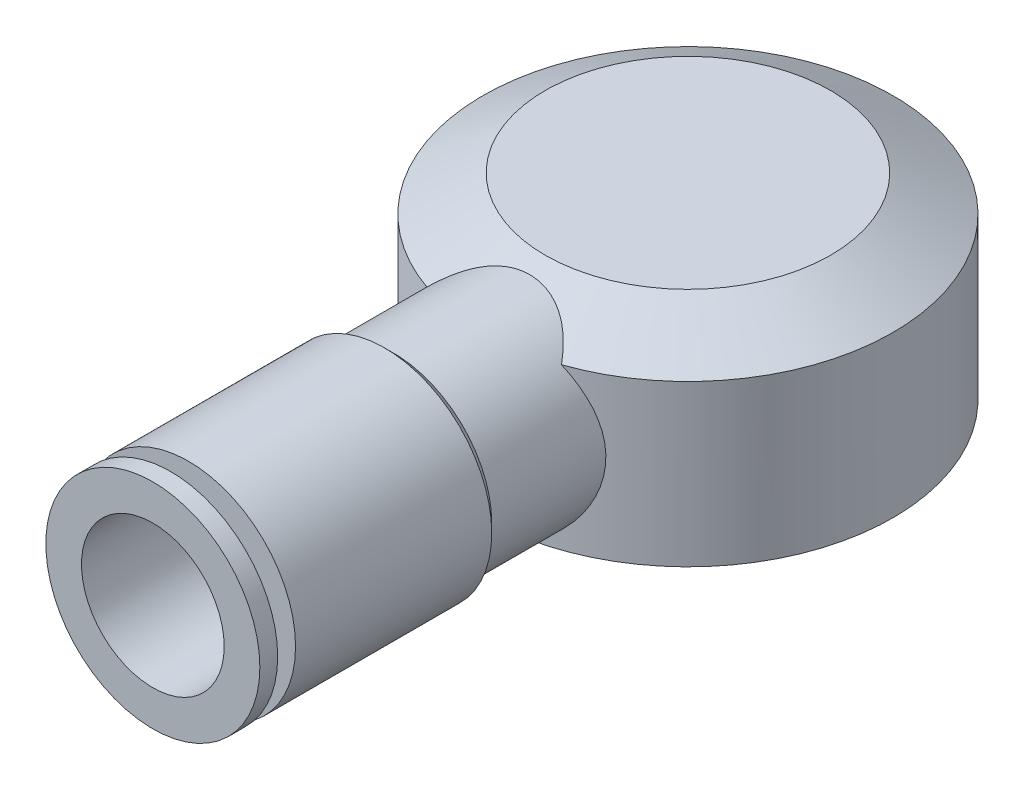
ISO-10303-21;
HEADER;
FILE_DESCRIPTION(('STEP AP214'),'2;1');
FILE_NAME('part.step','',(''),(''),'','','');
FILE_SCHEMA(('AUTOMOTIVE_DESIGN { 1 0 10303 214 1 1 1 1 }'));
ENDSEC;
DATA;
#1=APPLICATION_CONTEXT('core data for automotive mechanical design processes');
#2=APPLICATION_PROTOCOL_DEFINITION('international standard','automotive_design',2000,#1);
#3=PRODUCT_CONTEXT('',#1,'mechanical');
#4=PRODUCT('Part','Part','',(#3));
#5=PRODUCT_RELATED_PRODUCT_CATEGORY('part','',(#4));
#6=PRODUCT_DEFINITION_FORMATION('','',#4);
#7=PRODUCT_DEFINITION_CONTEXT('part definition',#1,'design');
#8=PRODUCT_DEFINITION('design','',#6,#7);
#9=PRODUCT_DEFINITION_SHAPE('','',#8);
#10=(LENGTH_UNIT() NAMED_UNIT(*) SI_UNIT(.MILLI.,.METRE.));
#11=(NAMED_UNIT(*) PLANE_ANGLE_UNIT() SI_UNIT($,.RADIAN.));
#12=(NAMED_UNIT(*) SI_UNIT($,.STERADIAN.) SOLID_ANGLE_UNIT());
#13=UNCERTAINTY_MEASURE_WITH_UNIT(LENGTH_MEASURE(1.E-05),#10,'distance_accuracy_value','');
#14=(GEOMETRIC_REPRESENTATION_CONTEXT(3) GLOBAL_UNCERTAINTY_ASSIGNED_CONTEXT((#13)) GLOBAL_UNIT_ASSIGNED_CONTEXT((#10,
#11,#12)) REPRESENTATION_CONTEXT('',''));
#15=CARTESIAN_POINT('',(0.,0.,0.));
#16=DIRECTION('',(0.,0.,1.));
#17=DIRECTION('',(1.,0.,0.));
#18=AXIS2_PLACEMENT_3D('',#15,#16,#17);
#19=CARTESIAN_POINT('',(0.,-0.5,30.));
#20=DIRECTION('',(0.,0.,-1.));
#21=DIRECTION('',(-1.,0.,0.));
#22=AXIS2_PLACEMENT_3D('',#19,#20,#21);
#23=CYLINDRICAL_SURFACE('',#22,5.5);
#24=CARTESIAN_POINT('',(0.,-0.5,16.5));
#25=DIRECTION('',(0.,0.,1.));
#26=DIRECTION('',(1.,0.,0.));
#27=AXIS2_PLACEMENT_3D('',#24,#25,#26);
#28=CIRCLE('',#27,5.5);
#29=CARTESIAN_POINT('',(5.5,-0.5,16.5));
#30=VERTEX_POINT('',#29);
#31=EDGE_CURVE('E11',#30,#30,#28,.F.);
#32=ORIENTED_EDGE('',*,*,#31,.T.);
#33=EDGE_LOOP('',(#32));
#34=FACE_BOUND('',#33,.T.);
#35=CARTESIAN_POINT('',(2.29128784747792,-5.5,11.2694276695846));
#36=CARTESIAN_POINT('',(2.16332183177203,-5.55865741634008,11.2954627808848));
#37=CARTESIAN_POINT('',(2.0327733527977,-5.61252171833584,11.319719403996));
#38=CARTESIAN_POINT('',(1.76727213018316,-5.71025185779454,11.3641879813943));
#39=CARTESIAN_POINT('',(1.63231797725142,-5.75411445935802,11.3843986264087));
#40=CARTESIAN_POINT('',(1.35902601568204,-5.83134070930998,11.4202469767592));
#41=CARTESIAN_POINT('',(1.22069279206306,-5.86471781590331,11.4358905421344));
#42=CARTESIAN_POINT('',(0.941418997011442,-5.92070162948489,11.4622594402245));
#43=CARTESIAN_POINT('',(0.80047879298711,-5.9433098423258,11.4729854605693));
#44=CARTESIAN_POINT('',(0.516571018248084,-5.9775591683018,11.4892744444924));
#45=CARTESIAN_POINT('',(0.373598882001552,-5.98916945114776,11.4948228932387));
#46=CARTESIAN_POINT('',(0.0870779835339535,-6.00117980743214,11.500563096685));
#47=CARTESIAN_POINT('',(-0.0564707793851179,-6.00157986729653,11.5007548448988));
#48=CARTESIAN_POINT('',(-0.343018319075714,-5.99116357890711,11.4957755127515));
#49=CARTESIAN_POINT('',(-0.486017286586552,-5.98035155585885,11.4906065003729));
#50=CARTESIAN_POINT('',(-0.770399379092881,-5.94765911189705,11.4750508416563));
#51=CARTESIAN_POINT('',(-0.911782788039692,-5.92578066760097,11.4646651270966));
#52=CARTESIAN_POINT('',(-1.26669733894422,-5.85660978749562,11.4320539956997));
#53=CARTESIAN_POINT('',(-1.47856229076389,-5.80198831353497,11.4064689242802));
#54=CARTESIAN_POINT('',(-1.78914539828149,-5.70200267332265,11.3604567919075));
#55=CARTESIAN_POINT('',(-1.89147079404537,-5.66566518496244,11.3438469770304));
#56=CARTESIAN_POINT('',(-2.09344988438805,-5.58715916673067,11.3083142264155));
#57=CARTESIAN_POINT('',(-2.19310357546404,-5.5449906292146,11.2893912876451));
#58=CARTESIAN_POINT('',(-2.29128784747792,-5.5,11.2694276695846));
#59=B_SPLINE_CURVE_WITH_KNOTS('',3,(#35,#36,#37,#38,#39,#40,#41,#42,#43,#44,#45,#46,#47,#48,#49,
#50,#51,#52,#53,#54,#55,#56,#57,#58),.UNSPECIFIED.,.F.,.F.,(4,2,2,2,2,2,2,2,2,2,2,4),(0.,
0.429388235295484,0.858915196192254,1.28788858232685,1.71680196596655,2.14691418685272,
2.57702692854529,3.00697381040276,3.43684392484351,4.09559086884254,4.42496487441658,
4.75433931180515),.UNSPECIFIED.);
#60=CARTESIAN_POINT('',(2.29128784747792,-5.5,11.2694276695846));
#61=VERTEX_POINT('',#60);
#62=CARTESIAN_POINT('',(-2.29128784747792,-5.5,11.2694276695846));
#63=VERTEX_POINT('',#62);
#64=EDGE_CURVE('E76',#61,#63,#59,.T.);
#65=ORIENTED_EDGE('',*,*,#64,.F.);
#66=CARTESIAN_POINT('',(2.29128784747792,-5.5,11.2694276695846));
#67=CARTESIAN_POINT('',(2.43556179242844,-5.43389465491582,11.2401108607116));
#68=CARTESIAN_POINT('',(2.57655030132472,-5.36172154362565,11.2085438188407));
#69=CARTESIAN_POINT('',(2.85110961310107,-5.20595883786792,11.1418590398797));
#70=CARTESIAN_POINT('',(2.98468371384165,-5.1223743772338,11.1067429013217));
#71=CARTESIAN_POINT('',(3.24361876672734,-4.94450205370198,11.0339040672568));
#72=CARTESIAN_POINT('',(3.36898470436219,-4.85022078477117,10.9961829831016));
#73=CARTESIAN_POINT('',(3.61091612443868,-4.65160163302456,10.919130941739));
#74=CARTESIAN_POINT('',(3.72748060573127,-4.54726260922201,10.8797998021731));
#75=CARTESIAN_POINT('',(4.0627413055903,-4.22040302460195,10.7610481402896));
#76=CARTESIAN_POINT('',(4.26754904472414,-3.98366437165846,10.6807092000023));
#77=CARTESIAN_POINT('',(4.63500618878252,-3.4773347984219,10.5264714336083));
#78=CARTESIAN_POINT('',(4.79764191506821,-3.2077332605172,10.4525747022004));
#79=CARTESIAN_POINT('',(5.00683312063114,-2.78189900558238,10.3531474346617));
#80=CARTESIAN_POINT('',(5.07103310343753,-2.63548942915635,10.321763076948));
#81=CARTESIAN_POINT('',(5.1867018583638,-2.33677358889108,10.2641270775928));
#82=CARTESIAN_POINT('',(5.23817654559538,-2.18447010294449,10.2378730524076));
#83=CARTESIAN_POINT('',(5.32773360844641,-1.87519370600202,10.1915552951888));
#84=CARTESIAN_POINT('',(5.36582697473725,-1.71822474245728,10.1714864846342));
#85=CARTESIAN_POINT('',(5.42813486260631,-1.4008287863051,10.1383728911199));
#86=CARTESIAN_POINT('',(5.45235132723556,-1.24040228109009,10.1253271248054));
#87=CARTESIAN_POINT('',(5.48472288498104,-0.934628966084372,10.1078242205261));
#88=CARTESIAN_POINT('',(5.49430164817405,-0.789474662751516,10.1026068613076));
#89=CARTESIAN_POINT('',(5.50192093419946,-0.49877682382283,10.0984596684539));
#90=CARTESIAN_POINT('',(5.49996221148336,-0.353233314299802,10.0995294236961));
#91=CARTESIAN_POINT('',(5.48453608111815,-0.0629882510670736,10.1079146814096));
#92=CARTESIAN_POINT('',(5.47107225730838,0.0817135507041956,10.1152282389357));
#93=CARTESIAN_POINT('',(5.4328224346528,0.369176020081381,10.1358231054274));
#94=CARTESIAN_POINT('',(5.408036508054,0.511936700067723,10.1491043763127));
#95=CARTESIAN_POINT('',(5.34926962079389,0.78598415756229,10.1801939285399));
#96=CARTESIAN_POINT('',(5.31592979452731,0.917445336355452,10.1976826745693));
#97=CARTESIAN_POINT('',(5.23985430076686,1.17697256489421,10.2369795964509));
#98=CARTESIAN_POINT('',(5.19711559843731,1.30503750301444,10.2587891672432));
#99=CARTESIAN_POINT('',(5.05526984379899,1.68327614357407,10.3298351338731));
#100=CARTESIAN_POINT('',(4.94254589136616,1.92743499444006,10.3846816933516));
#101=CARTESIAN_POINT('',(4.67525153156414,2.41094736676544,10.5078540529392));
#102=CARTESIAN_POINT('',(4.51834059832901,2.6488217565916,10.5768464985018));
#103=CARTESIAN_POINT('',(4.17091684528583,3.09631025103818,10.7186179064127));
#104=CARTESIAN_POINT('',(3.98049335808467,3.30599693624184,10.7913864481567));
#105=CARTESIAN_POINT('',(3.77491721763537,3.5,10.8627804912002));
#106=B_SPLINE_CURVE_WITH_KNOTS('',3,(#66,#67,#68,#69,#70,#71,#72,#73,#74,#75,#76,#77,#78,#79,
#80,#81,#82,#83,#84,#85,#86,#87,#88,#89,#90,#91,#92,#93,#94,#95,#96,#97,#98,#99,#100,#101,#102,
#103,#104,#105),.UNSPECIFIED.,.F.,.F.,(4,2,2,2,2,2,2,2,2,2,2,2,2,2,2,2,2,2,2,4),(0.,
0.483921956377554,0.967626914939124,1.45103530090805,1.93449859109217,2.89940900652383,
3.86463200361744,4.35281502291731,4.84077069113383,5.32832463747701,5.81581029956974,
6.25192270990199,6.68800660258229,7.12395470461406,7.55990002487463,7.96968135350486,
8.37959519263387,9.19960226633271,10.0758721912365,10.9498407255064),.UNSPECIFIED.);
#107=CARTESIAN_POINT('',(3.77491721763538,3.5,10.8627804912002));
#108=VERTEX_POINT('',#107);
#109=EDGE_CURVE('E84',#61,#108,#106,.T.);
#110=ORIENTED_EDGE('',*,*,#109,.T.);
#111=CARTESIAN_POINT('',(3.92798166492666,3.3498,11.0876327573788));
#112=CARTESIAN_POINT('',(3.85227054271796,3.42700915041923,10.9710765400676));
#113=CARTESIAN_POINT('',(3.77260657603547,3.5037699352088,10.8566755534735));
#114=CARTESIAN_POINT('',(3.60442559575136,3.65584996022649,10.6330434685222));
#115=CARTESIAN_POINT('',(3.51588837795678,3.73116542300263,10.5238250431823));
#116=CARTESIAN_POINT('',(3.32831100255927,3.88027672102203,10.3107806087991));
#117=CARTESIAN_POINT('',(3.2291639636951,3.9540459552695,10.2070290216288));
#118=CARTESIAN_POINT('',(3.02069938612885,4.09798188727608,10.0078275745858));
#119=CARTESIAN_POINT('',(2.91139125774933,4.16815182673122,9.91237018880058));
#120=CARTESIAN_POINT('',(2.62643275039944,4.33640357904428,9.68737851757455));
#121=CARTESIAN_POINT('',(2.44424583087738,4.4315904690175,9.56366369950086));
#122=CARTESIAN_POINT('',(2.1542634586172,4.56165553066639,9.39871158993973));
#123=CARTESIAN_POINT('',(2.05497887517661,4.6028395314225,9.34722551745926));
#124=CARTESIAN_POINT('',(1.85111999928086,4.6802724295322,9.25157731788618));
#125=CARTESIAN_POINT('',(1.74654832058762,4.71652373335028,9.20741161716807));
#126=CARTESIAN_POINT('',(1.53164887905345,4.78363932609074,9.12653011305156));
#127=CARTESIAN_POINT('',(1.42127581789236,4.81444908103254,9.0898891864934));
#128=CARTESIAN_POINT('',(1.19648925221007,4.86952518127374,9.02498767782651));
#129=CARTESIAN_POINT('',(1.08207559571005,4.89379128014969,8.99672741131582));
#130=CARTESIAN_POINT('',(0.850084281885877,4.93518642860911,8.94884563497363));
#131=CARTESIAN_POINT('',(0.732504108970082,4.9523096142151,8.92923122221352));
#132=CARTESIAN_POINT('',(0.495360853746841,4.97894592366719,8.89883850255076));
#133=CARTESIAN_POINT('',(0.375797999176811,4.98845991543455,8.88805918789406));
#134=CARTESIAN_POINT('',(0.150476660144256,4.99895321461652,8.87617986186019));
#135=CARTESIAN_POINT('',(0.0448115699299034,5.00083131904604,8.87406035444665));
#136=CARTESIAN_POINT('',(-0.166404121824042,4.99849662637139,8.87669929194587));
#137=CARTESIAN_POINT('',(-0.271954674209682,4.99428182350609,8.88146000179898));
#138=CARTESIAN_POINT('',(-0.482006433623073,4.97984878699043,8.89783210944835));
#139=CARTESIAN_POINT('',(-0.586508538165307,4.96963623135337,8.90943702794366));
#140=CARTESIAN_POINT('',(-0.79383500838538,4.9434133743194,8.9394312437851));
#141=CARTESIAN_POINT('',(-0.896658736613959,4.92740092130491,8.95782305894862));
#142=CARTESIAN_POINT('',(-1.09726893395269,4.89037424533464,9.00071723451855));
#143=CARTESIAN_POINT('',(-1.19511697781396,4.86949836722445,9.02505134718426));
#144=CARTESIAN_POINT('',(-1.3879124960737,4.82292693050771,9.07987219187361));
#145=CARTESIAN_POINT('',(-1.48285900568513,4.7972297886342,9.11036094528571));
#146=CARTESIAN_POINT('',(-1.7624054991209,4.71360318800119,9.21067671227134));
#147=CARTESIAN_POINT('',(-1.94193961901602,4.64909516666263,9.28940222177255));
#148=CARTESIAN_POINT('',(-2.3392654296207,4.48376572275927,9.49649738822354));
#149=CARTESIAN_POINT('',(-2.55084575396836,4.37793418444978,9.63269094601564));
#150=CARTESIAN_POINT('',(-2.94388436306477,4.15138600099305,9.93412544173802));
#151=CARTESIAN_POINT('',(-3.12522543731774,4.03061445755733,10.099474520716));
#152=CARTESIAN_POINT('',(-3.41251629207416,3.81593033865485,10.4019111888588));
#153=CARTESIAN_POINT('',(-3.52536911220135,3.72394916552749,10.5339747854879));
#154=CARTESIAN_POINT('',(-3.68409877618644,3.58439949739809,10.7379201331419));
#155=CARTESIAN_POINT('',(-3.73505758195933,3.53781945454121,10.8065755622811));
#156=CARTESIAN_POINT('',(-3.83383029880676,3.44415625651233,10.9457550357811));
#157=CARTESIAN_POINT('',(-3.8816448353097,3.3970732035735,11.0162787045902));
#158=CARTESIAN_POINT('',(-3.92798166492666,3.3498,11.0876327573788));
#159=B_SPLINE_CURVE_WITH_KNOTS('',3,(#111,#112,#113,#114,#115,#116,#117,#118,#119,#120,#121,
#122,#123,#124,#125,#126,#127,#128,#129,#130,#131,#132,#133,#134,#135,#136,#137,#138,#139,#140,
#141,#142,#143,#144,#145,#146,#147,#148,#149,#150,#151,#152,#153,#154,#155,#156,#157,#158),
.UNSPECIFIED.,.F.,.F.,(4,2,2,2,2,2,2,2,2,2,2,2,2,2,2,2,2,2,2,2,2,2,2,4),(0.,0.477037759203735,
0.955187527147896,1.4387124734892,1.92179399931102,2.6382824226259,2.9954666515384,
3.352475995025,3.7128819601115,4.07330149560674,4.43401633811007,4.79469003082157,
5.11140960065251,5.42823345706744,5.7447578618505,6.06139980977563,6.36994629762393,
6.67859428774559,7.29518927538828,8.10965255771046,8.92720288190725,9.51617187821192,
9.8082060070402,10.1001818703789),.UNSPECIFIED.);
#160=CARTESIAN_POINT('',(-3.77491721763538,3.5,10.8627804912002));
#161=VERTEX_POINT('',#160);
#162=EDGE_CURVE('E65',#108,#161,#159,.T.);
#163=ORIENTED_EDGE('',*,*,#162,.T.);
#164=CARTESIAN_POINT('',(-3.77491721763538,3.5,10.8627804912002));
#165=CARTESIAN_POINT('',(-3.88662547033847,3.39457805317176,10.8239667682746));
#166=CARTESIAN_POINT('',(-3.99384721573173,3.28454209736691,10.7847688677236));
#167=CARTESIAN_POINT('',(-4.19877316004089,3.05582379125193,10.7066473576306));
#168=CARTESIAN_POINT('',(-4.29647623546339,2.93714042316601,10.6677237809689));
#169=CARTESIAN_POINT('',(-4.48226965140227,2.69110378410769,10.5910066851183));
#170=CARTESIAN_POINT('',(-4.57030803805119,2.5637091112721,10.5532199974571));
#171=CARTESIAN_POINT('',(-4.73559994468453,2.30144873974218,10.4800887441248));
#172=CARTESIAN_POINT('',(-4.81285442127427,2.16658370520354,10.4447439619811));
#173=CARTESIAN_POINT('',(-4.9561879946267,1.88968077264792,10.3774992013846));
#174=CARTESIAN_POINT('',(-5.0222337116674,1.747623030964,10.3456096110446));
#175=CARTESIAN_POINT('',(-5.1422150606242,1.45760956237128,10.286500827708));
#176=CARTESIAN_POINT('',(-5.19615621895489,1.30965656346147,10.2592795047277));
#177=CARTESIAN_POINT('',(-5.29124493968612,1.00914097102611,10.2105621392723));
#178=CARTESIAN_POINT('',(-5.33242103580125,0.85658950701214,10.1890533432599));
#179=CARTESIAN_POINT('',(-5.40159432735927,0.547763666995555,10.1525521535699));
#180=CARTESIAN_POINT('',(-5.42959301391687,0.391489714321723,10.1375590226146));
#181=CARTESIAN_POINT('',(-5.47032539744472,0.0890288547119055,10.1156328931002));
#182=CARTESIAN_POINT('',(-5.48408961887544,-0.0569805248033952,10.1081570678928));
#183=CARTESIAN_POINT('',(-5.49990370493279,-0.349815747080359,10.0995615238893));
#184=CARTESIAN_POINT('',(-5.50195433021048,-0.496641536206662,10.0984413923708));
#185=CARTESIAN_POINT('',(-5.49431204767084,-0.789934368097286,10.1026012972053));
#186=CARTESIAN_POINT('',(-5.48461588281342,-0.936401300076013,10.1078831086295));
#187=CARTESIAN_POINT('',(-5.45361006752836,-1.22773488577771,10.1246454794049));
#188=CARTESIAN_POINT('',(-5.43230063951729,-1.37260157009431,10.1361259200404));
#189=CARTESIAN_POINT('',(-5.38022129637515,-1.64964287456203,10.1638586750465));
#190=CARTESIAN_POINT('',(-5.35021158461111,-1.78199998886814,10.1797240088705));
#191=CARTESIAN_POINT('',(-5.28069190562249,-2.04357800442548,10.2159591368138));
#192=CARTESIAN_POINT('',(-5.24117889794128,-2.17279788736381,10.2363303723703));
#193=CARTESIAN_POINT('',(-5.10891552247022,-2.55460760716664,10.303339583394));
#194=CARTESIAN_POINT('',(-5.00240428300408,-2.80153894359374,10.3558935659037));
#195=CARTESIAN_POINT('',(-4.74656160072275,-3.29337071634473,10.4757593258079));
#196=CARTESIAN_POINT('',(-4.5945798595665,-3.5366738595574,10.5438919792341));
#197=CARTESIAN_POINT('',(-4.25550308620597,-3.99601561824246,10.6852396988855));
#198=CARTESIAN_POINT('',(-4.06839597908916,-4.21204481501421,10.7584565074012));
#199=CARTESIAN_POINT('',(-3.75240164738835,-4.52428829092022,10.8712466142787));
#200=CARTESIAN_POINT('',(-3.63421964967805,-4.63133305660495,10.9114199079285));
#201=CARTESIAN_POINT('',(-3.38866115730367,-4.83502065510157,10.9901586920616));
#202=CARTESIAN_POINT('',(-3.2612847905922,-4.93166363262241,11.0287242049077));
#203=CARTESIAN_POINT('',(-2.9979078828943,-5.11391579046075,11.103209895735));
#204=CARTESIAN_POINT('',(-2.86189763910969,-5.19951221698115,11.139126995851));
#205=CARTESIAN_POINT('',(-2.58216239418221,-5.35884592544875,11.207286820192));
#206=CARTESIAN_POINT('',(-2.43843455473949,-5.4325788039432,11.2395281787854));
#207=CARTESIAN_POINT('',(-2.29128784747792,-5.5,11.2694276695846));
#208=B_SPLINE_CURVE_WITH_KNOTS('',3,(#164,#165,#166,#167,#168,#169,#170,#171,#172,#173,#174,
#175,#176,#177,#178,#179,#180,#181,#182,#183,#184,#185,#186,#187,#188,#189,#190,#191,#192,#193,
#194,#195,#196,#197,#198,#199,#200,#201,#202,#203,#204,#205,#206,#207),.UNSPECIFIED.,.F.,.F.,(4,
2,2,2,2,2,2,2,2,2,2,2,2,2,2,2,2,2,2,2,2,4),(0.,0.475152403215989,0.950360821136099,
1.42801016019202,1.90561710157721,2.38462230739382,2.86340837332095,3.34111636182969,
3.81877028138214,4.2587190524276,4.69863925399754,5.13868146044787,5.57871523953061,
5.9881748308474,6.39776559813836,7.21636584830505,8.09752370805769,8.97898503661035,
9.47179275597053,9.96459361853827,10.4579584490241,10.9515059838602),.UNSPECIFIED.);
#209=EDGE_CURVE('E59',#161,#63,#208,.T.);
#210=ORIENTED_EDGE('',*,*,#209,.T.);
#211=EDGE_LOOP('',(#65,#110,#163,#210));
#212=FACE_BOUND('',#211,.T.);
#213=ADVANCED_FACE('F43',(#34,#212),#23,.T.);
#214=CARTESIAN_POINT('',(0.,5.5,0.));
#215=DIRECTION('',(0.,1.,0.));
#216=DIRECTION('',(0.,0.,1.));
#217=AXIS2_PLACEMENT_3D('',#214,#215,#216);
#218=CYLINDRICAL_SURFACE('',#217,11.5);
#219=ORIENTED_EDGE('',*,*,#109,.F.);
#220=CARTESIAN_POINT('',(0.,-5.5,0.));
#221=DIRECTION('',(0.,1.,0.));
#222=DIRECTION('',(0.,0.,1.));
#223=AXIS2_PLACEMENT_3D('',#220,#221,#222);
#224=CIRCLE('',#223,11.5);
#225=EDGE_CURVE('E88',#61,#63,#224,.T.);
#226=ORIENTED_EDGE('',*,*,#225,.T.);
#227=ORIENTED_EDGE('',*,*,#209,.F.);
#228=CARTESIAN_POINT('',(0.,3.5,0.));
#229=DIRECTION('',(0.,1.,0.));
#230=DIRECTION('',(0.,0.,1.));
#231=AXIS2_PLACEMENT_3D('',#228,#229,#230);
#232=CIRCLE('',#231,11.5);
#233=EDGE_CURVE('E89',#108,#161,#232,.T.);
#234=ORIENTED_EDGE('',*,*,#233,.F.);
#235=EDGE_LOOP('',(#219,#226,#227,#234));
#236=FACE_BOUND('',#235,.T.);
#237=ADVANCED_FACE('F87',(#236),#218,.T.);
#238=CARTESIAN_POINT('',(0.,3.5,0.));
#239=DIRECTION('',(0.,-1.,0.));
#240=DIRECTION('',(0.,0.,-1.));
#241=AXIS2_PLACEMENT_3D('',#238,#239,#240);
#242=CONICAL_SURFACE('',#241,11.5,1.05165021254837);
#243=CARTESIAN_POINT('',(0.,5.5,0.));
#244=DIRECTION('',(0.,1.,0.));
#245=DIRECTION('',(0.,0.,1.));
#246=AXIS2_PLACEMENT_3D('',#243,#244,#245);
#247=CIRCLE('',#246,8.);
#248=CARTESIAN_POINT('',(0.,5.5,8.));
#249=VERTEX_POINT('',#248);
#250=EDGE_CURVE('E92',#249,#249,#247,.T.);
#251=ORIENTED_EDGE('',*,*,#250,.F.);
#252=EDGE_LOOP('',(#251));
#253=FACE_BOUND('',#252,.T.);
#254=ORIENTED_EDGE('',*,*,#162,.F.);
#255=ORIENTED_EDGE('',*,*,#233,.T.);
#256=EDGE_LOOP('',(#254,#255));
#257=FACE_BOUND('',#256,.T.);
#258=ADVANCED_FACE('F144',(#253,#257),#242,.T.);
#259=CARTESIAN_POINT('',(0.,-5.5,0.));
#260=DIRECTION('',(0.,1.,0.));
#261=DIRECTION('',(0.,0.,1.));
#262=AXIS2_PLACEMENT_3D('',#259,#260,#261);
#263=PLANE('',#262);
#264=CARTESIAN_POINT('',(0.,-5.5,0.));
#265=DIRECTION('',(0.,1.,0.));
#266=DIRECTION('',(0.,0.,1.));
#267=AXIS2_PLACEMENT_3D('',#264,#265,#266);
#268=CIRCLE('',#267,7.);
#269=CARTESIAN_POINT('',(0.,-5.5,7.));
#270=VERTEX_POINT('',#269);
#271=EDGE_CURVE('E111',#270,#270,#268,.T.);
#272=ORIENTED_EDGE('',*,*,#271,.T.);
#273=EDGE_LOOP('',(#272));
#274=FACE_BOUND('',#273,.T.);
#275=ORIENTED_EDGE('',*,*,#225,.F.);
#276=CARTESIAN_POINT('',(0.,-5.5,0.));
#277=DIRECTION('',(0.,-1.,0.));
#278=DIRECTION('',(0.,0.,-1.));
#279=AXIS2_PLACEMENT_3D('',#276,#277,#278);
#280=CIRCLE('',#279,11.5);
#281=EDGE_CURVE('E73',#61,#63,#280,.T.);
#282=ORIENTED_EDGE('',*,*,#281,.T.);
#283=EDGE_LOOP('',(#275,#282));
#284=FACE_BOUND('',#283,.T.);
#285=ADVANCED_FACE('F91',(#274,#284),#263,.F.);
#286=CARTESIAN_POINT('',(0.,5.5,0.));
#287=DIRECTION('',(0.,-1.,0.));
#288=DIRECTION('',(0.,0.,-1.));
#289=AXIS2_PLACEMENT_3D('',#286,#287,#288);
#290=PLANE('',#289);
#291=ORIENTED_EDGE('',*,*,#250,.T.);
#292=EDGE_LOOP('',(#291));
#293=FACE_BOUND('',#292,.T.);
#294=ADVANCED_FACE('F168',(#293),#290,.F.);
#295=CARTESIAN_POINT('',(0.,-0.5,28.));
#296=DIRECTION('',(0.,0.,1.));
#297=DIRECTION('',(1.,0.,0.));
#298=AXIS2_PLACEMENT_3D('',#295,#296,#297);
#299=PLANE('',#298);
#300=CARTESIAN_POINT('',(0.,-0.5,28.));
#301=DIRECTION('',(0.,0.,1.));
#302=DIRECTION('',(1.,0.,0.));
#303=AXIS2_PLACEMENT_3D('',#300,#301,#302);
#304=CIRCLE('',#303,4.5);
#305=CARTESIAN_POINT('',(4.5,-0.5,28.));
#306=VERTEX_POINT('',#305);
#307=EDGE_CURVE('E199',#306,#306,#304,.T.);
#308=ORIENTED_EDGE('',*,*,#307,.F.);
#309=EDGE_LOOP('',(#308));
#310=FACE_BOUND('',#309,.T.);
#311=CARTESIAN_POINT('',(0.,-0.5,28.));
#312=DIRECTION('',(0.,0.,1.));
#313=DIRECTION('',(1.,0.,0.));
#314=AXIS2_PLACEMENT_3D('',#311,#312,#313);
#315=CIRCLE('',#314,6.);
#316=CARTESIAN_POINT('',(6.,-0.5,28.));
#317=VERTEX_POINT('',#316);
#318=EDGE_CURVE('E220',#317,#317,#315,.T.);
#319=ORIENTED_EDGE('',*,*,#318,.T.);
#320=EDGE_LOOP('',(#319));
#321=FACE_BOUND('',#320,.T.);
#322=ADVANCED_FACE('F172',(#310,#321),#299,.T.);
#323=CARTESIAN_POINT('',(0.,-0.5,29.));
#324=DIRECTION('',(0.,0.,1.));
#325=DIRECTION('',(1.,0.,0.));
#326=AXIS2_PLACEMENT_3D('',#323,#324,#325);
#327=PLANE('',#326);
#328=CARTESIAN_POINT('',(0.,-0.5,29.));
#329=DIRECTION('',(0.,0.,1.));
#330=DIRECTION('',(1.,0.,0.));
#331=AXIS2_PLACEMENT_3D('',#328,#329,#330);
#332=CIRCLE('',#331,4.5);
#333=CARTESIAN_POINT('',(4.5,-0.5,29.));
#334=VERTEX_POINT('',#333);
#335=EDGE_CURVE('E85',#334,#334,#332,.T.);
#336=ORIENTED_EDGE('',*,*,#335,.T.);
#337=EDGE_LOOP('',(#336));
#338=FACE_BOUND('',#337,.T.);
#339=CARTESIAN_POINT('',(0.,-0.5,29.));
#340=DIRECTION('',(0.,0.,1.));
#341=DIRECTION('',(1.,0.,0.));
#342=AXIS2_PLACEMENT_3D('',#339,#340,#341);
#343=CIRCLE('',#342,6.);
#344=CARTESIAN_POINT('',(6.,-0.5,29.));
#345=VERTEX_POINT('',#344);
#346=EDGE_CURVE('E215',#345,#345,#343,.F.);
#347=ORIENTED_EDGE('',*,*,#346,.T.);
#348=EDGE_LOOP('',(#347));
#349=FACE_BOUND('',#348,.T.);
#350=ADVANCED_FACE('F176',(#338,#349),#327,.F.);
#351=CARTESIAN_POINT('',(0.,-0.5,28.));
#352=DIRECTION('',(0.,0.,1.));
#353=DIRECTION('',(1.,0.,0.));
#354=AXIS2_PLACEMENT_3D('',#351,#352,#353);
#355=CYLINDRICAL_SURFACE('',#354,4.5);
#356=ORIENTED_EDGE('',*,*,#307,.T.);
#357=EDGE_LOOP('',(#356));
#358=FACE_BOUND('',#357,.T.);
#359=ORIENTED_EDGE('',*,*,#335,.F.);
#360=EDGE_LOOP('',(#359));
#361=FACE_BOUND('',#360,.T.);
#362=ADVANCED_FACE('F202',(#358,#361),#355,.T.);
#363=CARTESIAN_POINT('',(0.,-0.5,30.));
#364=DIRECTION('',(0.,0.,1.));
#365=DIRECTION('',(1.,0.,0.));
#366=AXIS2_PLACEMENT_3D('',#363,#364,#365);
#367=PLANE('',#366);
#368=CARTESIAN_POINT('',(0.,-0.5,30.));
#369=DIRECTION('',(0.,0.,1.));
#370=DIRECTION('',(1.,0.,0.));
#371=AXIS2_PLACEMENT_3D('',#368,#369,#370);
#372=CIRCLE('',#371,4.);
#373=CARTESIAN_POINT('',(4.,-0.5,30.));
#374=VERTEX_POINT('',#373);
#375=EDGE_CURVE('E79',#374,#374,#372,.T.);
#376=ORIENTED_EDGE('',*,*,#375,.F.);
#377=EDGE_LOOP('',(#376));
#378=FACE_BOUND('',#377,.T.);
#379=CARTESIAN_POINT('',(0.,-0.5,30.));
#380=DIRECTION('',(0.,0.,1.));
#381=DIRECTION('',(1.,0.,0.));
#382=AXIS2_PLACEMENT_3D('',#379,#380,#381);
#383=CIRCLE('',#382,6.);
#384=CARTESIAN_POINT('',(6.,-0.5,30.));
#385=VERTEX_POINT('',#384);
#386=EDGE_CURVE('E216',#385,#385,#383,.T.);
#387=ORIENTED_EDGE('',*,*,#386,.T.);
#388=EDGE_LOOP('',(#387));
#389=FACE_BOUND('',#388,.T.);
#390=ADVANCED_FACE('F148',(#378,#389),#367,.T.);
#391=CARTESIAN_POINT('',(0.,-11.5,0.));
#392=DIRECTION('',(0.,1.,0.));
#393=DIRECTION('',(0.,0.,1.));
#394=AXIS2_PLACEMENT_3D('',#391,#392,#393);
#395=CYLINDRICAL_SURFACE('',#394,11.5);
#396=ORIENTED_EDGE('',*,*,#64,.T.);
#397=ORIENTED_EDGE('',*,*,#281,.F.);
#398=EDGE_LOOP('',(#396,#397));
#399=FACE_BOUND('',#398,.T.);
#400=ADVANCED_FACE('F75',(#399),#395,.F.);
#401=CARTESIAN_POINT('',(0.,-0.5,-4.00000000000002));
#402=DIRECTION('',(0.,0.,1.));
#403=DIRECTION('',(1.,0.,0.));
#404=AXIS2_PLACEMENT_3D('',#401,#402,#403);
#405=CYLINDRICAL_SURFACE('',#404,4.);
#406=CARTESIAN_POINT('',(4.,-0.5,5.74456264653803));
#407=CARTESIAN_POINT('',(4.00000017792025,-0.601767522553603,5.74456250545587));
#408=CARTESIAN_POINT('',(3.99611042485061,-0.70353736922505,5.74727688160871));
#409=CARTESIAN_POINT('',(3.98061907020161,-0.906205661147559,5.75801696810235));
#410=CARTESIAN_POINT('',(3.96901693967327,-1.00710404614908,5.76604304274277));
#411=CARTESIAN_POINT('',(3.9382742171273,-1.20728739119746,5.78708409064427));
#412=CARTESIAN_POINT('',(3.91912841930449,-1.30657118766209,5.80010250890285));
#413=CARTESIAN_POINT('',(3.87357848981441,-1.50277096969048,5.83062055670279));
#414=CARTESIAN_POINT('',(3.84717112531079,-1.59968587965553,5.84812218192167));
#415=CARTESIAN_POINT('',(3.75794741305098,-1.88462949984062,5.90617198044726));
#416=CARTESIAN_POINT('',(3.68488684049058,-2.0683917717442,5.95244229157764));
#417=CARTESIAN_POINT('',(3.51407629259215,-2.42086744407695,6.05484423697809));
#418=CARTESIAN_POINT('',(3.4163184031718,-2.58957599715303,6.11097903049384));
#419=CARTESIAN_POINT('',(3.18636025123525,-2.92762289897959,6.23425561773627));
#420=CARTESIAN_POINT('',(3.05155705444501,-3.09499718661885,6.30192924373378));
#421=CARTESIAN_POINT('',(2.75657710268269,-3.4064187746265,6.43642141906034));
#422=CARTESIAN_POINT('',(2.59638396124896,-3.55045088789137,6.50323938584584));
#423=CARTESIAN_POINT('',(2.33095355934187,-3.75278790638099,6.60126746318317));
#424=CARTESIAN_POINT('',(2.23359579523793,-3.8204194017494,6.63492350456753));
#425=CARTESIAN_POINT('',(2.03255701186538,-3.94714590915982,6.69924089530022));
#426=CARTESIAN_POINT('',(1.92887861298698,-4.00624442500894,6.72990347213864));
#427=CARTESIAN_POINT('',(1.71583329400293,-4.11527754169198,6.78734754715991));
#428=CARTESIAN_POINT('',(1.60646858635657,-4.16521567295554,6.81413053970133));
#429=CARTESIAN_POINT('',(1.38277843619592,-4.2553235419714,6.86301836790378));
#430=CARTESIAN_POINT('',(1.26845372023142,-4.29549470474949,6.88512388595924));
#431=CARTESIAN_POINT('',(1.04606947200347,-4.36238340692042,6.92223249632158));
#432=CARTESIAN_POINT('',(0.93834873786946,-4.38997598167244,6.93769052466444));
#433=CARTESIAN_POINT('',(0.720418193066244,-4.43616561364356,6.96369402042387));
#434=CARTESIAN_POINT('',(0.610208716123547,-4.45476386954102,6.97424014244627));
#435=CARTESIAN_POINT('',(0.388318624379015,-4.48267546314335,6.99010528336901));
#436=CARTESIAN_POINT('',(0.276639020010883,-4.4919948719441,6.99542772006381));
#437=CARTESIAN_POINT('',(0.0527706357266093,-4.5012203308954,7.00069636051492));
#438=CARTESIAN_POINT('',(-0.0594180983909202,-4.5011272115973,7.00064303862238));
#439=CARTESIAN_POINT('',(-0.270588992729399,-4.49207341161305,6.99547270441839));
#440=CARTESIAN_POINT('',(-0.369629485716548,-4.48411703034873,6.99092918439792));
#441=CARTESIAN_POINT('',(-0.566584096830257,-4.46091312301965,6.9777323170488));
#442=CARTESIAN_POINT('',(-0.664497859955334,-4.44566336012161,6.96907770888135));
#443=CARTESIAN_POINT('',(-0.955447946680943,-4.38922154521661,6.93722044931018));
#444=CARTESIAN_POINT('',(-1.14589037489433,-4.3373280798742,6.90811897598486));
#445=CARTESIAN_POINT('',(-1.51638709607226,-4.2066949387277,6.83641752053745));
#446=CARTESIAN_POINT('',(-1.69633410728861,-4.12772092693491,6.79369994957736));
#447=CARTESIAN_POINT('',(-2.04074820005986,-3.94576589636681,6.69830567756088));
#448=CARTESIAN_POINT('',(-2.20521069702783,-3.8427777987879,6.64562604078221));
#449=CARTESIAN_POINT('',(-2.53386204816625,-3.60250455422647,6.52789047479463));
#450=CARTESIAN_POINT('',(-2.69591831444933,-3.46265841184721,6.4621086702537));
#451=CARTESIAN_POINT('',(-2.99557441346805,-3.1593439692112,6.32878303653682));
#452=CARTESIAN_POINT('',(-3.13314416666622,-2.99584705667863,6.26123715550483));
#453=CARTESIAN_POINT('',(-3.39374323072975,-2.63018504301795,6.12423546303104));
#454=CARTESIAN_POINT('',(-3.51395802446782,-2.42579027704187,6.05525992205908));
#455=CARTESIAN_POINT('',(-3.66657174031791,-2.10324928956635,5.96320410606823));
#456=CARTESIAN_POINT('',(-3.71281794554,-1.99310283606189,5.93442503661623));
#457=CARTESIAN_POINT('',(-3.79556701484217,-1.7680844605832,5.88184151841211));
#458=CARTESIAN_POINT('',(-3.8320732854033,-1.6532142069935,5.85803533105962));
#459=CARTESIAN_POINT('',(-3.91171237868206,-1.35626696195109,5.80533681299947));
#460=CARTESIAN_POINT('',(-3.94775185206161,-1.17144039332366,5.78065648689545));
#461=CARTESIAN_POINT('',(-3.99339004750995,-0.797200602794641,5.74922925693539));
#462=CARTESIAN_POINT('',(-4.00301412009456,-0.607791954530399,5.74246515932664));
#463=CARTESIAN_POINT('',(-3.99533473613593,-0.229679339332261,5.74780966622119));
#464=CARTESIAN_POINT('',(-3.97801535736587,-0.040975855183732,5.75992943014501));
#465=CARTESIAN_POINT('',(-3.91740362631824,0.330300933032768,5.80131440447044));
#466=CARTESIAN_POINT('',(-3.87409235173031,0.512869668601711,5.8305921056245));
#467=CARTESIAN_POINT('',(-3.76281718778972,0.869905803551649,5.90301826270413));
#468=CARTESIAN_POINT('',(-3.69455136011587,1.04424311526667,5.94633583391191));
#469=CARTESIAN_POINT('',(-3.53571246453579,1.37968519236047,6.04212883183863));
#470=CARTESIAN_POINT('',(-3.44513029677264,1.54078452390881,6.09460799179689));
#471=CARTESIAN_POINT('',(-3.22683516814651,1.87348957603514,6.21332590526351));
#472=CARTESIAN_POINT('',(-3.09545280086553,2.04238923715585,6.28040170680803));
#473=CARTESIAN_POINT('',(-2.80728946913643,2.35739165231652,6.41438594927416));
#474=CARTESIAN_POINT('',(-2.65048749122816,2.50347534736686,6.48129420482182));
#475=CARTESIAN_POINT('',(-2.38980955794405,2.70979052884022,6.58017094111007));
#476=CARTESIAN_POINT('',(-2.29381649227938,2.77910085102284,6.61432852399849));
#477=CARTESIAN_POINT('',(-2.09540006644167,2.90930538752235,6.67983478238711));
#478=CARTESIAN_POINT('',(-1.99297948230204,2.97020319929895,6.71118465652419));
#479=CARTESIAN_POINT('',(-1.7822835921089,3.08297967961904,6.77018725880405));
#480=CARTESIAN_POINT('',(-1.674008905465,3.13485929991849,6.79784037702139));
#481=CARTESIAN_POINT('',(-1.45237919836931,3.22895068113635,6.84861328093426));
#482=CARTESIAN_POINT('',(-1.33902739384187,3.27116846129399,6.87173588779857));
#483=CARTESIAN_POINT('',(-1.11744959385316,3.34236008292347,6.91107262137708));
#484=CARTESIAN_POINT('',(-1.00955142062729,3.37212935922653,6.92769446294717));
#485=CARTESIAN_POINT('',(-0.791073501078647,3.42259641519742,6.95602801697983));
#486=CARTESIAN_POINT('',(-0.680495230325553,3.4432990720543,6.96774236917105));
#487=CARTESIAN_POINT('',(-0.457615629851301,3.47533109220991,6.98592036480936));
#488=CARTESIAN_POINT('',(-0.345315175258244,3.4866650653031,6.99238659053146));
#489=CARTESIAN_POINT('',(-0.119981172032726,3.49979217867283,6.999879105561));
#490=CARTESIAN_POINT('',(-0.00694769585055421,3.50158624788601,7.00090592452407));
#491=CARTESIAN_POINT('',(0.205591059210679,3.49595796189336,6.99769088625791));
#492=CARTESIAN_POINT('',(0.305135322655308,3.48958698034105,6.9940500424018));
#493=CARTESIAN_POINT('',(0.503263638161902,3.46946391289531,6.98259086738289));
#494=CARTESIAN_POINT('',(0.601847380025348,3.45570951806109,6.97477122943116));
#495=CARTESIAN_POINT('',(0.797296353688942,3.42099009643362,6.95513892171739));
#496=CARTESIAN_POINT('',(0.894162192117851,3.40002767050066,6.94332769226017));
#497=CARTESIAN_POINT('',(1.08559609101996,3.35113721952732,6.91598531946425));
#498=CARTESIAN_POINT('',(1.18016324876334,3.32320650492045,6.90045273987952));
#499=CARTESIAN_POINT('',(1.45976685703936,3.22930176553661,6.84871646764508));
#500=CARTESIAN_POINT('',(1.6405864603491,3.15323664819466,6.80738678400023));
#501=CARTESIAN_POINT('',(1.98702604128474,2.97701072441002,6.71446322287619));
#502=CARTESIAN_POINT('',(2.15264184190507,2.8768433234514,6.66286653695899));
#503=CARTESIAN_POINT('',(2.4836338303549,2.64277241200215,6.54717784020934));
#504=CARTESIAN_POINT('',(2.64698386905322,2.50637128384522,6.48233579401827));
#505=CARTESIAN_POINT('',(2.94978302276014,2.20993876104993,6.35028671705981));
#506=CARTESIAN_POINT('',(3.08920319736281,2.04987918341737,6.28307693949415));
#507=CARTESIAN_POINT('',(3.35492012622472,1.69077124123509,6.14565950765112));
#508=CARTESIAN_POINT('',(3.47831821792643,1.48939581750145,6.07587376818233));
#509=CARTESIAN_POINT('',(3.68889308968536,1.06462761820422,5.95039255855266));
#510=CARTESIAN_POINT('',(3.77612918315148,0.841271646177332,5.89467407425522));
#511=CARTESIAN_POINT('',(3.89446299531894,0.431418917681392,5.81695795891842));
#512=CARTESIAN_POINT('',(3.93385738898721,0.248258583598881,5.79015222232913));
#513=CARTESIAN_POINT('',(3.97344482237813,-0.0303505964878455,5.76298155052645));
#514=CARTESIAN_POINT('',(3.98338995277653,-0.123871173846865,5.75609762566707));
#515=CARTESIAN_POINT('',(3.99666646398732,-0.311593979456268,5.74688892504079));
#516=CARTESIAN_POINT('',(3.99999983530306,-0.405795993982322,5.74456277713475));
#517=CARTESIAN_POINT('',(4.,-0.5,5.74456264653803));
#518=B_SPLINE_CURVE_WITH_KNOTS('',3,(#406,#407,#408,#409,#410,#411,#412,#413,#414,#415,#416,
#417,#418,#419,#420,#421,#422,#423,#424,#425,#426,#427,#428,#429,#430,#431,#432,#433,#434,#435,
#436,#437,#438,#439,#440,#441,#442,#443,#444,#445,#446,#447,#448,#449,#450,#451,#452,#453,#454,
#455,#456,#457,#458,#459,#460,#461,#462,#463,#464,#465,#466,#467,#468,#469,#470,#471,#472,#473,
#474,#475,#476,#477,#478,#479,#480,#481,#482,#483,#484,#485,#486,#487,#488,#489,#490,#491,#492,
#493,#494,#495,#496,#497,#498,#499,#500,#501,#502,#503,#504,#505,#506,#507,#508,#509,#510,#511,
#512,#513,#514,#515,#516,#517),.UNSPECIFIED.,.T.,.F.,(4,2,2,2,2,2,2,2,2,2,2,2,2,2,2,2,2,2,2,2,2,
2,2,2,2,2,2,2,2,2,2,2,2,2,2,2,2,2,2,2,2,2,2,2,2,2,2,2,2,2,2,2,2,2,2,4),(0.,0.305197063051328,
0.610415060027545,0.915844054665694,1.22140924650362,1.82790796604458,2.43460128091261,
3.1078971199053,3.78162928133011,4.15089858438408,4.520015824422,4.88899050570487,
5.25791132028472,5.59423956661072,5.93052297790605,6.26658621603624,6.60261980033366,
6.90064091359103,7.19875348667915,7.7943934357571,8.39532344113384,8.99643081138253,
9.66548971270188,10.3353649058334,11.0719848204853,11.4401367917138,11.8081598348095,
12.3752119288645,12.9417196398241,13.508562255586,14.0758180388164,14.6501777091916,
15.2247719729936,15.8948940295698,16.5655729031095,16.9348482311232,17.3039651530398,
17.6730430956551,18.0418904762984,18.380880410126,18.7196877670976,19.0583283169085,
19.3969358914006,19.6960183338639,19.9951943599125,20.294262547922,20.5934463470389,
21.192174321383,21.7910662976042,22.4557684337384,23.1212688711274,23.8563890627725,
24.590298683068,25.1554256779336,25.4380251235465,25.7205394782525),.UNSPECIFIED.);
#519=CARTESIAN_POINT('',(4.,-0.5,5.74456264653803));
#520=VERTEX_POINT('',#519);
#521=EDGE_CURVE('E104',#520,#520,#518,.T.);
#522=ORIENTED_EDGE('',*,*,#521,.T.);
#523=EDGE_LOOP('',(#522));
#524=FACE_BOUND('',#523,.T.);
#525=ORIENTED_EDGE('',*,*,#375,.T.);
#526=EDGE_LOOP('',(#525));
#527=FACE_BOUND('',#526,.T.);
#528=ADVANCED_FACE('F113',(#524,#527),#405,.F.);
#529=CARTESIAN_POINT('',(0.,-29.5,0.));
#530=DIRECTION('',(0.,1.,0.));
#531=DIRECTION('',(0.,0.,1.));
#532=AXIS2_PLACEMENT_3D('',#529,#530,#531);
#533=CYLINDRICAL_SURFACE('',#532,7.);
#534=ORIENTED_EDGE('',*,*,#521,.F.);
#535=EDGE_LOOP('',(#534));
#536=FACE_BOUND('',#535,.T.);
#537=CARTESIAN_POINT('',(0.,4.5,0.));
#538=DIRECTION('',(0.,1.,0.));
#539=DIRECTION('',(0.,0.,1.));
#540=AXIS2_PLACEMENT_3D('',#537,#538,#539);
#541=CIRCLE('',#540,7.);
#542=CARTESIAN_POINT('',(0.,4.5,7.));
#543=VERTEX_POINT('',#542);
#544=EDGE_CURVE('E112',#543,#543,#541,.T.);
#545=ORIENTED_EDGE('',*,*,#544,.T.);
#546=EDGE_LOOP('',(#545));
#547=FACE_BOUND('',#546,.T.);
#548=ORIENTED_EDGE('',*,*,#271,.F.);
#549=EDGE_LOOP('',(#548));
#550=FACE_BOUND('',#549,.T.);
#551=ADVANCED_FACE('F116',(#536,#547,#550),#533,.F.);
#552=CARTESIAN_POINT('',(0.,4.5,0.));
#553=DIRECTION('',(0.,1.,0.));
#554=DIRECTION('',(0.,0.,1.));
#555=AXIS2_PLACEMENT_3D('',#552,#553,#554);
#556=PLANE('',#555);
#557=ORIENTED_EDGE('',*,*,#544,.F.);
#558=EDGE_LOOP('',(#557));
#559=FACE_BOUND('',#558,.T.);
#560=ADVANCED_FACE('F120',(#559),#556,.F.);
#561=CARTESIAN_POINT('',(0.,-0.5,12.0294372515229));
#562=DIRECTION('',(0.,0.,1.));
#563=DIRECTION('',(1.,0.,0.));
#564=AXIS2_PLACEMENT_3D('',#561,#562,#563);
#565=CYLINDRICAL_SURFACE('',#564,6.);
#566=ORIENTED_EDGE('',*,*,#346,.F.);
#567=EDGE_LOOP('',(#566));
#568=FACE_BOUND('',#567,.T.);
#569=ORIENTED_EDGE('',*,*,#386,.F.);
#570=EDGE_LOOP('',(#569));
#571=FACE_BOUND('',#570,.T.);
#572=ADVANCED_FACE('F124',(#568,#571),#565,.T.);
#573=CARTESIAN_POINT('',(0.,-0.5,16.));
#574=DIRECTION('',(0.,0.,1.));
#575=DIRECTION('',(1.,0.,0.));
#576=AXIS2_PLACEMENT_3D('',#573,#574,#575);
#577=CYLINDRICAL_SURFACE('',#576,6.);
#578=CARTESIAN_POINT('',(0.,-0.5,17.));
#579=DIRECTION('',(0.,0.,1.));
#580=DIRECTION('',(1.,0.,0.));
#581=AXIS2_PLACEMENT_3D('',#578,#579,#580);
#582=CIRCLE('',#581,6.);
#583=CARTESIAN_POINT('',(6.,-0.5,17.));
#584=VERTEX_POINT('',#583);
#585=EDGE_CURVE('E52',#584,#584,#582,.T.);
#586=ORIENTED_EDGE('',*,*,#585,.T.);
#587=EDGE_LOOP('',(#586));
#588=FACE_BOUND('',#587,.T.);
#589=ORIENTED_EDGE('',*,*,#318,.F.);
#590=EDGE_LOOP('',(#589));
#591=FACE_BOUND('',#590,.T.);
#592=ADVANCED_FACE('F128',(#588,#591),#577,.T.);
#593=CARTESIAN_POINT('',(0.,-0.5,17.));
#594=DIRECTION('',(0.,0.,1.));
#595=DIRECTION('',(1.,0.,0.));
#596=AXIS2_PLACEMENT_3D('',#593,#594,#595);
#597=CONICAL_SURFACE('',#596,6.,0.785398163397443);
#598=ORIENTED_EDGE('',*,*,#31,.F.);
#599=EDGE_LOOP('',(#598));
#600=FACE_BOUND('',#599,.T.);
#601=ORIENTED_EDGE('',*,*,#585,.F.);
#602=EDGE_LOOP('',(#601));
#603=FACE_BOUND('',#602,.T.);
#604=ADVANCED_FACE('F46',(#600,#603),#597,.T.);
#605=CLOSED_SHELL('',(#213,#237,#258,#285,#294,#322,#350,#362,#390,#400,#528,#551,#560,#572,
#592,#604));
#606=MANIFOLD_SOLID_BREP('B2',#605);
#607=ADVANCED_BREP_SHAPE_REPRESENTATION('',(#18,#606),#14);
#608=SHAPE_DEFINITION_REPRESENTATION(#9,#607);
ENDSEC;
END-ISO-10303-21;
